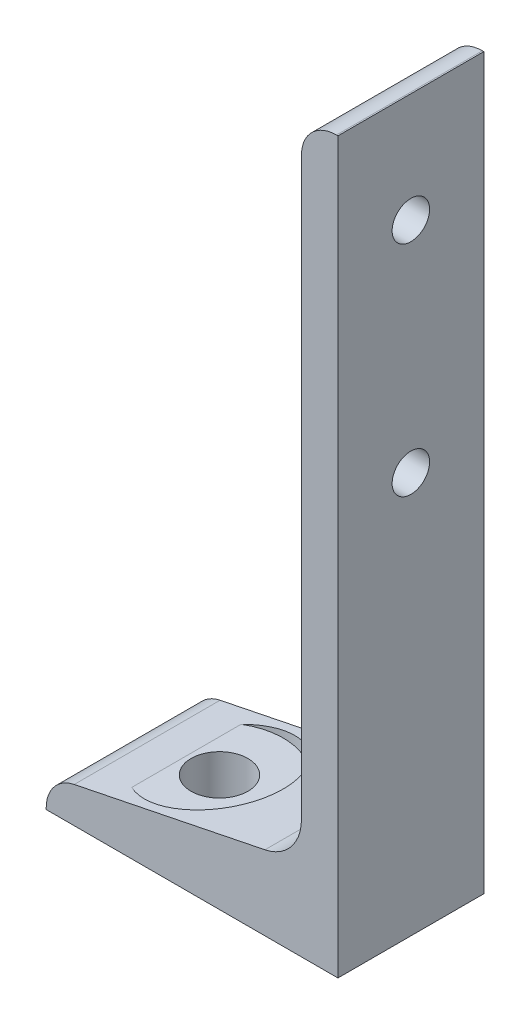
ISO-10303-21;
HEADER;
FILE_DESCRIPTION(('STEP AP214'),'2;1');
FILE_NAME('part.step','',(''),(''),'','','');
FILE_SCHEMA(('AUTOMOTIVE_DESIGN { 1 0 10303 214 1 1 1 1 }'));
ENDSEC;
DATA;
#1=APPLICATION_CONTEXT('core data for automotive mechanical design processes');
#2=APPLICATION_PROTOCOL_DEFINITION('international standard','automotive_design',2000,#1);
#3=PRODUCT_CONTEXT('',#1,'mechanical');
#4=PRODUCT('Part','Part','',(#3));
#5=PRODUCT_RELATED_PRODUCT_CATEGORY('part','',(#4));
#6=PRODUCT_DEFINITION_FORMATION('','',#4);
#7=PRODUCT_DEFINITION_CONTEXT('part definition',#1,'design');
#8=PRODUCT_DEFINITION('design','',#6,#7);
#9=PRODUCT_DEFINITION_SHAPE('','',#8);
#10=(LENGTH_UNIT() NAMED_UNIT(*) SI_UNIT(.MILLI.,.METRE.));
#11=(NAMED_UNIT(*) PLANE_ANGLE_UNIT() SI_UNIT($,.RADIAN.));
#12=(NAMED_UNIT(*) SI_UNIT($,.STERADIAN.) SOLID_ANGLE_UNIT());
#13=UNCERTAINTY_MEASURE_WITH_UNIT(LENGTH_MEASURE(1.E-05),#10,'distance_accuracy_value','');
#14=(GEOMETRIC_REPRESENTATION_CONTEXT(3) GLOBAL_UNCERTAINTY_ASSIGNED_CONTEXT((#13)) GLOBAL_UNIT_ASSIGNED_CONTEXT((#10,
#11,#12)) REPRESENTATION_CONTEXT('',''));
#15=CARTESIAN_POINT('',(0.,0.,0.));
#16=DIRECTION('',(0.,0.,1.));
#17=DIRECTION('',(1.,0.,0.));
#18=AXIS2_PLACEMENT_3D('',#15,#16,#17);
#19=CARTESIAN_POINT('',(-45.9188691631727,6.2277181818673,12.7));
#20=DIRECTION('',(0.199289560887908,-0.979940646631777,0.));
#21=DIRECTION('',(0.979940646631777,0.199289560887908,0.));
#22=AXIS2_PLACEMENT_3D('',#19,#20,#21);
#23=PLANE('',#22);
#24=DIRECTION('',(-0.979940646631777,-0.199289560887908,0.));
#25=VECTOR('',#24,1.);
#26=CARTESIAN_POINT('',(-45.9188691631727,6.2277181818673,-12.7));
#27=LINE('',#26,#25);
#28=CARTESIAN_POINT('',(-12.7056391104523,12.9822599550109,-12.7));
#29=VERTEX_POINT('',#28);
#30=CARTESIAN_POINT('',(-45.9188691631727,6.2277181818673,-12.7));
#31=VERTEX_POINT('',#30);
#32=EDGE_CURVE('E117',#29,#31,#27,.T.);
#33=ORIENTED_EDGE('',*,*,#32,.T.);
#34=DIRECTION('',(0.,0.,-1.));
#35=VECTOR('',#34,1.);
#36=CARTESIAN_POINT('',(-45.9188691631727,6.2277181818673,12.7));
#37=LINE('',#36,#35);
#38=CARTESIAN_POINT('',(-45.9188691631727,6.2277181818673,12.7));
#39=VERTEX_POINT('',#38);
#40=EDGE_CURVE('E167',#39,#31,#37,.T.);
#41=ORIENTED_EDGE('',*,*,#40,.F.);
#42=DIRECTION('',(-0.979940646631777,-0.199289560887908,0.));
#43=VECTOR('',#42,1.);
#44=CARTESIAN_POINT('',(-45.9188691631727,6.2277181818673,12.7));
#45=LINE('',#44,#43);
#46=CARTESIAN_POINT('',(-12.7056391104523,12.9822599550109,12.7));
#47=VERTEX_POINT('',#46);
#48=EDGE_CURVE('E81',#47,#39,#45,.T.);
#49=ORIENTED_EDGE('',*,*,#48,.F.);
#50=DIRECTION('',(0.,0.,-1.));
#51=VECTOR('',#50,1.);
#52=CARTESIAN_POINT('',(-12.7056391104523,12.9822599550109,12.7));
#53=LINE('',#52,#51);
#54=EDGE_CURVE('E163',#47,#29,#53,.T.);
#55=ORIENTED_EDGE('',*,*,#54,.T.);
#56=EDGE_LOOP('',(#33,#41,#49,#55));
#57=FACE_BOUND('',#56,.T.);
#58=CARTESIAN_POINT('',(-33.3248,8.7889615816053,0.));
#59=DIRECTION('',(0.199289560887908,-0.979940646631777,0.));
#60=DIRECTION('',(-0.979940646631777,-0.199289560887908,0.));
#61=AXIS2_PLACEMENT_3D('',#58,#59,#60);
#62=ELLIPSE('',#61,11.339972515882,11.1125);
#63=CARTESIAN_POINT('',(-39.0727827998131,7.62,9.51043374316085));
#64=VERTEX_POINT('',#63);
#65=CARTESIAN_POINT('',(-39.0727827998131,7.62,-9.51043374316085));
#66=VERTEX_POINT('',#65);
#67=EDGE_CURVE('E12',#64,#66,#62,.F.);
#68=ORIENTED_EDGE('',*,*,#67,.F.);
#69=DIRECTION('',(0.,0.,1.));
#70=VECTOR('',#69,1.);
#71=CARTESIAN_POINT('',(-39.0727827998131,7.62,12.7));
#72=LINE('',#71,#70);
#73=EDGE_CURVE('E246',#66,#64,#72,.T.);
#74=ORIENTED_EDGE('',*,*,#73,.F.);
#75=EDGE_LOOP('',(#68,#74));
#76=FACE_BOUND('',#75,.T.);
#77=ADVANCED_FACE('F59',(#57,#76),#23,.F.);
#78=CARTESIAN_POINT('',(-44.704,0.253999999999984,12.7));
#79=DIRECTION('',(0.,0.,-1.));
#80=DIRECTION('',(-1.,0.,0.));
#81=AXIS2_PLACEMENT_3D('',#78,#79,#80);
#82=CYLINDRICAL_SURFACE('',#81,6.096);
#83=CARTESIAN_POINT('',(-44.704,0.253999999999984,-12.7));
#84=DIRECTION('',(0.,0.,1.));
#85=DIRECTION('',(-1.,0.,0.));
#86=AXIS2_PLACEMENT_3D('',#83,#84,#85);
#87=CIRCLE('',#86,6.096);
#88=CARTESIAN_POINT('',(-50.8,0.253999999999984,-12.7));
#89=VERTEX_POINT('',#88);
#90=EDGE_CURVE('E171',#31,#89,#87,.T.);
#91=ORIENTED_EDGE('',*,*,#90,.T.);
#92=DIRECTION('',(0.,0.,-1.));
#93=VECTOR('',#92,1.);
#94=CARTESIAN_POINT('',(-50.8,0.253999999999984,12.7));
#95=LINE('',#94,#93);
#96=CARTESIAN_POINT('',(-50.8,0.253999999999984,12.7));
#97=VERTEX_POINT('',#96);
#98=EDGE_CURVE('E67',#97,#89,#95,.T.);
#99=ORIENTED_EDGE('',*,*,#98,.F.);
#100=CARTESIAN_POINT('',(-44.704,0.253999999999984,12.7));
#101=DIRECTION('',(0.,0.,1.));
#102=DIRECTION('',(-1.,0.,0.));
#103=AXIS2_PLACEMENT_3D('',#100,#101,#102);
#104=CIRCLE('',#103,6.096);
#105=EDGE_CURVE('E189',#39,#97,#104,.T.);
#106=ORIENTED_EDGE('',*,*,#105,.F.);
#107=ORIENTED_EDGE('',*,*,#40,.T.);
#108=EDGE_LOOP('',(#91,#99,#106,#107));
#109=FACE_BOUND('',#108,.T.);
#110=ADVANCED_FACE('F61',(#109),#82,.T.);
#111=CARTESIAN_POINT('',(-50.8,0.,12.7));
#112=DIRECTION('',(1.,0.,0.));
#113=DIRECTION('',(0.,0.,-1.));
#114=AXIS2_PLACEMENT_3D('',#111,#112,#113);
#115=PLANE('',#114);
#116=DIRECTION('',(0.,-1.,0.));
#117=VECTOR('',#116,1.);
#118=CARTESIAN_POINT('',(-50.8,0.,-12.7));
#119=LINE('',#118,#117);
#120=CARTESIAN_POINT('',(-50.8,0.,-12.7));
#121=VERTEX_POINT('',#120);
#122=EDGE_CURVE('E174',#89,#121,#119,.T.);
#123=ORIENTED_EDGE('',*,*,#122,.T.);
#124=DIRECTION('',(0.,0.,-1.));
#125=VECTOR('',#124,1.);
#126=CARTESIAN_POINT('',(-50.8,0.,12.7));
#127=LINE('',#126,#125);
#128=CARTESIAN_POINT('',(-50.8,0.,12.7));
#129=VERTEX_POINT('',#128);
#130=EDGE_CURVE('E202',#129,#121,#127,.T.);
#131=ORIENTED_EDGE('',*,*,#130,.F.);
#132=DIRECTION('',(0.,-1.,0.));
#133=VECTOR('',#132,1.);
#134=CARTESIAN_POINT('',(-50.8,0.,12.7));
#135=LINE('',#134,#133);
#136=EDGE_CURVE('E126',#97,#129,#135,.T.);
#137=ORIENTED_EDGE('',*,*,#136,.F.);
#138=ORIENTED_EDGE('',*,*,#98,.T.);
#139=EDGE_LOOP('',(#123,#131,#137,#138));
#140=FACE_BOUND('',#139,.T.);
#141=ADVANCED_FACE('F205',(#140),#115,.F.);
#142=CARTESIAN_POINT('',(0.,0.,12.7));
#143=DIRECTION('',(0.,1.,0.));
#144=DIRECTION('',(-1.,0.,0.));
#145=AXIS2_PLACEMENT_3D('',#142,#143,#144);
#146=PLANE('',#145);
#147=CARTESIAN_POINT('',(-33.3248,0.,0.));
#148=DIRECTION('',(0.,1.,0.));
#149=DIRECTION('',(0.,0.,1.));
#150=AXIS2_PLACEMENT_3D('',#147,#148,#149);
#151=CIRCLE('',#150,4.953);
#152=CARTESIAN_POINT('',(-33.3248,0.,4.953));
#153=VERTEX_POINT('',#152);
#154=EDGE_CURVE('E241',#153,#153,#151,.T.);
#155=ORIENTED_EDGE('',*,*,#154,.T.);
#156=EDGE_LOOP('',(#155));
#157=FACE_BOUND('',#156,.T.);
#158=DIRECTION('',(1.,0.,0.));
#159=VECTOR('',#158,1.);
#160=CARTESIAN_POINT('',(0.,0.,-12.7));
#161=LINE('',#160,#159);
#162=CARTESIAN_POINT('',(0.,0.,-12.7));
#163=VERTEX_POINT('',#162);
#164=EDGE_CURVE('E177',#121,#163,#161,.T.);
#165=ORIENTED_EDGE('',*,*,#164,.T.);
#166=DIRECTION('',(0.,0.,-1.));
#167=VECTOR('',#166,1.);
#168=CARTESIAN_POINT('',(0.,0.,12.7));
#169=LINE('',#168,#167);
#170=CARTESIAN_POINT('',(0.,0.,12.7));
#171=VERTEX_POINT('',#170);
#172=EDGE_CURVE('E199',#171,#163,#169,.T.);
#173=ORIENTED_EDGE('',*,*,#172,.F.);
#174=DIRECTION('',(1.,0.,0.));
#175=VECTOR('',#174,1.);
#176=CARTESIAN_POINT('',(0.,0.,12.7));
#177=LINE('',#176,#175);
#178=EDGE_CURVE('E225',#129,#171,#177,.T.);
#179=ORIENTED_EDGE('',*,*,#178,.F.);
#180=ORIENTED_EDGE('',*,*,#130,.T.);
#181=EDGE_LOOP('',(#165,#173,#179,#180));
#182=FACE_BOUND('',#181,.T.);
#183=ADVANCED_FACE('F216',(#157,#182),#146,.F.);
#184=CARTESIAN_POINT('',(0.,127.,12.7));
#185=DIRECTION('',(-1.,0.,0.));
#186=DIRECTION('',(0.,-1.,0.));
#187=AXIS2_PLACEMENT_3D('',#184,#185,#186);
#188=PLANE('',#187);
#189=CARTESIAN_POINT('',(0.,107.95,0.));
#190=DIRECTION('',(-1.,0.,0.));
#191=DIRECTION('',(0.,-1.,0.));
#192=AXIS2_PLACEMENT_3D('',#189,#190,#191);
#193=CIRCLE('',#192,3.2639);
#194=CARTESIAN_POINT('',(0.,104.6861,0.));
#195=VERTEX_POINT('',#194);
#196=EDGE_CURVE('E235',#195,#195,#193,.T.);
#197=ORIENTED_EDGE('',*,*,#196,.T.);
#198=EDGE_LOOP('',(#197));
#199=FACE_BOUND('',#198,.T.);
#200=CARTESIAN_POINT('',(0.,69.85,0.));
#201=DIRECTION('',(-1.,0.,0.));
#202=DIRECTION('',(0.,-1.,0.));
#203=AXIS2_PLACEMENT_3D('',#200,#201,#202);
#204=CIRCLE('',#203,3.2639);
#205=CARTESIAN_POINT('',(0.,66.5861,0.));
#206=VERTEX_POINT('',#205);
#207=EDGE_CURVE('E175',#206,#206,#204,.T.);
#208=ORIENTED_EDGE('',*,*,#207,.T.);
#209=EDGE_LOOP('',(#208));
#210=FACE_BOUND('',#209,.T.);
#211=DIRECTION('',(0.,1.,0.));
#212=VECTOR('',#211,1.);
#213=CARTESIAN_POINT('',(0.,127.,-12.7));
#214=LINE('',#213,#212);
#215=CARTESIAN_POINT('',(0.,127.,-12.7));
#216=VERTEX_POINT('',#215);
#217=EDGE_CURVE('E179',#163,#216,#214,.T.);
#218=ORIENTED_EDGE('',*,*,#217,.T.);
#219=DIRECTION('',(0.,0.,-1.));
#220=VECTOR('',#219,1.);
#221=CARTESIAN_POINT('',(0.,127.,12.7));
#222=LINE('',#221,#220);
#223=CARTESIAN_POINT('',(0.,127.,12.7));
#224=VERTEX_POINT('',#223);
#225=EDGE_CURVE('E196',#224,#216,#222,.T.);
#226=ORIENTED_EDGE('',*,*,#225,.F.);
#227=DIRECTION('',(0.,1.,0.));
#228=VECTOR('',#227,1.);
#229=CARTESIAN_POINT('',(0.,127.,12.7));
#230=LINE('',#229,#228);
#231=EDGE_CURVE('E222',#171,#224,#230,.T.);
#232=ORIENTED_EDGE('',*,*,#231,.F.);
#233=ORIENTED_EDGE('',*,*,#172,.T.);
#234=EDGE_LOOP('',(#218,#226,#232,#233));
#235=FACE_BOUND('',#234,.T.);
#236=ADVANCED_FACE('F220',(#199,#210,#235),#188,.F.);
#237=CARTESIAN_POINT('',(-0.253999999999965,127.,12.7));
#238=DIRECTION('',(0.,-1.,0.));
#239=DIRECTION('',(0.,0.,-1.));
#240=AXIS2_PLACEMENT_3D('',#237,#238,#239);
#241=PLANE('',#240);
#242=DIRECTION('',(-1.,0.,0.));
#243=VECTOR('',#242,1.);
#244=CARTESIAN_POINT('',(-0.253999999999965,127.,-12.7));
#245=LINE('',#244,#243);
#246=CARTESIAN_POINT('',(-0.253999999999965,127.,-12.7));
#247=VERTEX_POINT('',#246);
#248=EDGE_CURVE('E181',#216,#247,#245,.T.);
#249=ORIENTED_EDGE('',*,*,#248,.T.);
#250=DIRECTION('',(0.,0.,-1.));
#251=VECTOR('',#250,1.);
#252=CARTESIAN_POINT('',(-0.253999999999965,127.,12.7));
#253=LINE('',#252,#251);
#254=CARTESIAN_POINT('',(-0.253999999999965,127.,12.7));
#255=VERTEX_POINT('',#254);
#256=EDGE_CURVE('E193',#255,#247,#253,.T.);
#257=ORIENTED_EDGE('',*,*,#256,.F.);
#258=DIRECTION('',(-1.,0.,0.));
#259=VECTOR('',#258,1.);
#260=CARTESIAN_POINT('',(-0.253999999999965,127.,12.7));
#261=LINE('',#260,#259);
#262=EDGE_CURVE('E224',#224,#255,#261,.T.);
#263=ORIENTED_EDGE('',*,*,#262,.F.);
#264=ORIENTED_EDGE('',*,*,#225,.T.);
#265=EDGE_LOOP('',(#249,#257,#263,#264));
#266=FACE_BOUND('',#265,.T.);
#267=ADVANCED_FACE('F288',(#266),#241,.F.);
#268=CARTESIAN_POINT('',(-0.254000000000008,120.904,12.7));
#269=DIRECTION('',(0.,0.,-1.));
#270=DIRECTION('',(-1.,0.,0.));
#271=AXIS2_PLACEMENT_3D('',#268,#269,#270);
#272=CYLINDRICAL_SURFACE('',#271,6.096);
#273=CARTESIAN_POINT('',(-0.254000000000008,120.904,-12.7));
#274=DIRECTION('',(0.,0.,1.));
#275=DIRECTION('',(-1.,0.,0.));
#276=AXIS2_PLACEMENT_3D('',#273,#274,#275);
#277=CIRCLE('',#276,6.096);
#278=CARTESIAN_POINT('',(-6.35000000000001,120.904,-12.7));
#279=VERTEX_POINT('',#278);
#280=EDGE_CURVE('E183',#247,#279,#277,.T.);
#281=ORIENTED_EDGE('',*,*,#280,.T.);
#282=DIRECTION('',(0.,0.,-1.));
#283=VECTOR('',#282,1.);
#284=CARTESIAN_POINT('',(-6.35000000000001,120.904,12.7));
#285=LINE('',#284,#283);
#286=CARTESIAN_POINT('',(-6.35000000000001,120.904,12.7));
#287=VERTEX_POINT('',#286);
#288=EDGE_CURVE('E162',#287,#279,#285,.T.);
#289=ORIENTED_EDGE('',*,*,#288,.F.);
#290=CARTESIAN_POINT('',(-0.254000000000008,120.904,12.7));
#291=DIRECTION('',(0.,0.,1.));
#292=DIRECTION('',(-1.,0.,0.));
#293=AXIS2_PLACEMENT_3D('',#290,#291,#292);
#294=CIRCLE('',#293,6.096);
#295=EDGE_CURVE('E150',#255,#287,#294,.T.);
#296=ORIENTED_EDGE('',*,*,#295,.F.);
#297=ORIENTED_EDGE('',*,*,#256,.T.);
#298=EDGE_LOOP('',(#281,#289,#296,#297));
#299=FACE_BOUND('',#298,.T.);
#300=ADVANCED_FACE('F284',(#299),#272,.T.);
#301=CARTESIAN_POINT('',(-6.35,20.7605388376507,12.7));
#302=DIRECTION('',(1.,0.,0.));
#303=DIRECTION('',(0.,1.,0.));
#304=AXIS2_PLACEMENT_3D('',#301,#302,#303);
#305=PLANE('',#304);
#306=CARTESIAN_POINT('',(-6.35,107.95,0.));
#307=DIRECTION('',(-1.,0.,0.));
#308=DIRECTION('',(0.,-1.,0.));
#309=AXIS2_PLACEMENT_3D('',#306,#307,#308);
#310=CIRCLE('',#309,3.2639);
#311=CARTESIAN_POINT('',(-6.35,104.6861,0.));
#312=VERTEX_POINT('',#311);
#313=EDGE_CURVE('E238',#312,#312,#310,.T.);
#314=ORIENTED_EDGE('',*,*,#313,.F.);
#315=EDGE_LOOP('',(#314));
#316=FACE_BOUND('',#315,.T.);
#317=CARTESIAN_POINT('',(-6.35,69.85,0.));
#318=DIRECTION('',(-1.,0.,0.));
#319=DIRECTION('',(0.,-1.,0.));
#320=AXIS2_PLACEMENT_3D('',#317,#318,#319);
#321=CIRCLE('',#320,3.2639);
#322=CARTESIAN_POINT('',(-6.35,66.5861,0.));
#323=VERTEX_POINT('',#322);
#324=EDGE_CURVE('E232',#323,#323,#321,.T.);
#325=ORIENTED_EDGE('',*,*,#324,.F.);
#326=EDGE_LOOP('',(#325));
#327=FACE_BOUND('',#326,.T.);
#328=DIRECTION('',(0.,-1.,0.));
#329=VECTOR('',#328,1.);
#330=CARTESIAN_POINT('',(-6.35,20.7605388376507,-12.7));
#331=LINE('',#330,#329);
#332=CARTESIAN_POINT('',(-6.35,20.7605388376507,-12.7));
#333=VERTEX_POINT('',#332);
#334=EDGE_CURVE('E159',#279,#333,#331,.T.);
#335=ORIENTED_EDGE('',*,*,#334,.T.);
#336=DIRECTION('',(0.,0.,-1.));
#337=VECTOR('',#336,1.);
#338=CARTESIAN_POINT('',(-6.35,20.7605388376507,12.7));
#339=LINE('',#338,#337);
#340=CARTESIAN_POINT('',(-6.35,20.7605388376507,12.7));
#341=VERTEX_POINT('',#340);
#342=EDGE_CURVE('E156',#341,#333,#339,.T.);
#343=ORIENTED_EDGE('',*,*,#342,.F.);
#344=DIRECTION('',(0.,-1.,0.));
#345=VECTOR('',#344,1.);
#346=CARTESIAN_POINT('',(-6.35,20.7605388376507,12.7));
#347=LINE('',#346,#345);
#348=EDGE_CURVE('E143',#287,#341,#347,.T.);
#349=ORIENTED_EDGE('',*,*,#348,.F.);
#350=ORIENTED_EDGE('',*,*,#288,.T.);
#351=EDGE_LOOP('',(#335,#343,#349,#350));
#352=FACE_BOUND('',#351,.T.);
#353=ADVANCED_FACE('F157',(#316,#327,#352),#305,.F.);
#354=CARTESIAN_POINT('',(-14.2875,20.7605388376507,12.7));
#355=DIRECTION('',(0.,0.,-1.));
#356=DIRECTION('',(-1.,0.,0.));
#357=AXIS2_PLACEMENT_3D('',#354,#355,#356);
#358=CYLINDRICAL_SURFACE('',#357,7.9375);
#359=CARTESIAN_POINT('',(-14.2875,20.7605388376507,-12.7));
#360=DIRECTION('',(0.,0.,-1.));
#361=DIRECTION('',(1.,0.,0.));
#362=AXIS2_PLACEMENT_3D('',#359,#360,#361);
#363=CIRCLE('',#362,7.9375);
#364=EDGE_CURVE('E186',#333,#29,#363,.T.);
#365=ORIENTED_EDGE('',*,*,#364,.T.);
#366=ORIENTED_EDGE('',*,*,#54,.F.);
#367=CARTESIAN_POINT('',(-14.2875,20.7605388376507,12.7));
#368=DIRECTION('',(0.,0.,-1.));
#369=DIRECTION('',(1.,0.,0.));
#370=AXIS2_PLACEMENT_3D('',#367,#368,#369);
#371=CIRCLE('',#370,7.9375);
#372=EDGE_CURVE('E147',#341,#47,#371,.T.);
#373=ORIENTED_EDGE('',*,*,#372,.F.);
#374=ORIENTED_EDGE('',*,*,#342,.T.);
#375=EDGE_LOOP('',(#365,#366,#373,#374));
#376=FACE_BOUND('',#375,.T.);
#377=ADVANCED_FACE('F165',(#376),#358,.F.);
#378=CARTESIAN_POINT('',(-44.704,0.253999999999984,12.7));
#379=DIRECTION('',(0.,0.,-1.));
#380=DIRECTION('',(-1.,0.,0.));
#381=AXIS2_PLACEMENT_3D('',#378,#379,#380);
#382=PLANE('',#381);
#383=ORIENTED_EDGE('',*,*,#105,.T.);
#384=ORIENTED_EDGE('',*,*,#136,.T.);
#385=ORIENTED_EDGE('',*,*,#178,.T.);
#386=ORIENTED_EDGE('',*,*,#231,.T.);
#387=ORIENTED_EDGE('',*,*,#262,.T.);
#388=ORIENTED_EDGE('',*,*,#295,.T.);
#389=ORIENTED_EDGE('',*,*,#348,.T.);
#390=ORIENTED_EDGE('',*,*,#372,.T.);
#391=ORIENTED_EDGE('',*,*,#48,.T.);
#392=EDGE_LOOP('',(#383,#384,#385,#386,#387,#388,#389,#390,#391));
#393=FACE_BOUND('',#392,.T.);
#394=ADVANCED_FACE('F145',(#393),#382,.F.);
#395=CARTESIAN_POINT('',(-44.704,0.253999999999984,-12.7));
#396=DIRECTION('',(0.,0.,-1.));
#397=DIRECTION('',(-1.,0.,0.));
#398=AXIS2_PLACEMENT_3D('',#395,#396,#397);
#399=PLANE('',#398);
#400=ORIENTED_EDGE('',*,*,#90,.F.);
#401=ORIENTED_EDGE('',*,*,#32,.F.);
#402=ORIENTED_EDGE('',*,*,#364,.F.);
#403=ORIENTED_EDGE('',*,*,#334,.F.);
#404=ORIENTED_EDGE('',*,*,#280,.F.);
#405=ORIENTED_EDGE('',*,*,#248,.F.);
#406=ORIENTED_EDGE('',*,*,#217,.F.);
#407=ORIENTED_EDGE('',*,*,#164,.F.);
#408=ORIENTED_EDGE('',*,*,#122,.F.);
#409=EDGE_LOOP('',(#400,#401,#402,#403,#404,#405,#406,#407,#408));
#410=FACE_BOUND('',#409,.T.);
#411=ADVANCED_FACE('F210',(#410),#399,.T.);
#412=CARTESIAN_POINT('',(0.,69.85,0.));
#413=DIRECTION('',(-1.,0.,0.));
#414=DIRECTION('',(0.,-1.,0.));
#415=AXIS2_PLACEMENT_3D('',#412,#413,#414);
#416=CYLINDRICAL_SURFACE('',#415,3.2639);
#417=ORIENTED_EDGE('',*,*,#207,.F.);
#418=EDGE_LOOP('',(#417));
#419=FACE_BOUND('',#418,.T.);
#420=ORIENTED_EDGE('',*,*,#324,.T.);
#421=EDGE_LOOP('',(#420));
#422=FACE_BOUND('',#421,.T.);
#423=ADVANCED_FACE('F267',(#419,#422),#416,.F.);
#424=CARTESIAN_POINT('',(0.,107.95,0.));
#425=DIRECTION('',(-1.,0.,0.));
#426=DIRECTION('',(0.,-1.,0.));
#427=AXIS2_PLACEMENT_3D('',#424,#425,#426);
#428=CYLINDRICAL_SURFACE('',#427,3.2639);
#429=ORIENTED_EDGE('',*,*,#196,.F.);
#430=EDGE_LOOP('',(#429));
#431=FACE_BOUND('',#430,.T.);
#432=ORIENTED_EDGE('',*,*,#313,.T.);
#433=EDGE_LOOP('',(#432));
#434=FACE_BOUND('',#433,.T.);
#435=ADVANCED_FACE('F258',(#431,#434),#428,.F.);
#436=CARTESIAN_POINT('',(-33.3248,0.,0.));
#437=DIRECTION('',(0.,1.,0.));
#438=DIRECTION('',(0.,0.,1.));
#439=AXIS2_PLACEMENT_3D('',#436,#437,#438);
#440=CYLINDRICAL_SURFACE('',#439,4.953);
#441=ORIENTED_EDGE('',*,*,#154,.F.);
#442=EDGE_LOOP('',(#441));
#443=FACE_BOUND('',#442,.T.);
#444=CARTESIAN_POINT('',(-33.3248,7.62,0.));
#445=DIRECTION('',(0.,1.,0.));
#446=DIRECTION('',(0.,0.,1.));
#447=AXIS2_PLACEMENT_3D('',#444,#445,#446);
#448=CIRCLE('',#447,4.953);
#449=CARTESIAN_POINT('',(-33.3248,7.62,4.953));
#450=VERTEX_POINT('',#449);
#451=EDGE_CURVE('E248',#450,#450,#448,.F.);
#452=ORIENTED_EDGE('',*,*,#451,.F.);
#453=EDGE_LOOP('',(#452));
#454=FACE_BOUND('',#453,.T.);
#455=ADVANCED_FACE('F255',(#443,#454),#440,.F.);
#456=CARTESIAN_POINT('',(-33.3248,127.,0.));
#457=DIRECTION('',(0.,-1.,0.));
#458=DIRECTION('',(0.,0.,-1.));
#459=AXIS2_PLACEMENT_3D('',#456,#457,#458);
#460=CYLINDRICAL_SURFACE('',#459,11.1125);
#461=ORIENTED_EDGE('',*,*,#67,.T.);
#462=CARTESIAN_POINT('',(-33.3248,7.62,0.));
#463=DIRECTION('',(0.,1.,0.));
#464=DIRECTION('',(0.,0.,1.));
#465=AXIS2_PLACEMENT_3D('',#462,#463,#464);
#466=CIRCLE('',#465,11.1125);
#467=EDGE_CURVE('E73',#64,#66,#466,.T.);
#468=ORIENTED_EDGE('',*,*,#467,.F.);
#469=EDGE_LOOP('',(#461,#468));
#470=FACE_BOUND('',#469,.T.);
#471=ADVANCED_FACE('F257',(#470),#460,.F.);
#472=CARTESIAN_POINT('',(-33.3248,7.62,0.));
#473=DIRECTION('',(0.,1.,0.));
#474=DIRECTION('',(0.,0.,1.));
#475=AXIS2_PLACEMENT_3D('',#472,#473,#474);
#476=PLANE('',#475);
#477=ORIENTED_EDGE('',*,*,#451,.T.);
#478=EDGE_LOOP('',(#477));
#479=FACE_BOUND('',#478,.T.);
#480=ORIENTED_EDGE('',*,*,#73,.T.);
#481=ORIENTED_EDGE('',*,*,#467,.T.);
#482=EDGE_LOOP('',(#480,#481));
#483=FACE_BOUND('',#482,.T.);
#484=ADVANCED_FACE('F253',(#479,#483),#476,.T.);
#485=CLOSED_SHELL('',(#77,#110,#141,#183,#236,#267,#300,#353,#377,#394,#411,#423,#435,#455,#471,#484));
#486=MANIFOLD_SOLID_BREP('B2',#485);
#487=ADVANCED_BREP_SHAPE_REPRESENTATION('',(#18,#486),#14);
#488=SHAPE_DEFINITION_REPRESENTATION(#9,#487);
ENDSEC;
END-ISO-10303-21;
